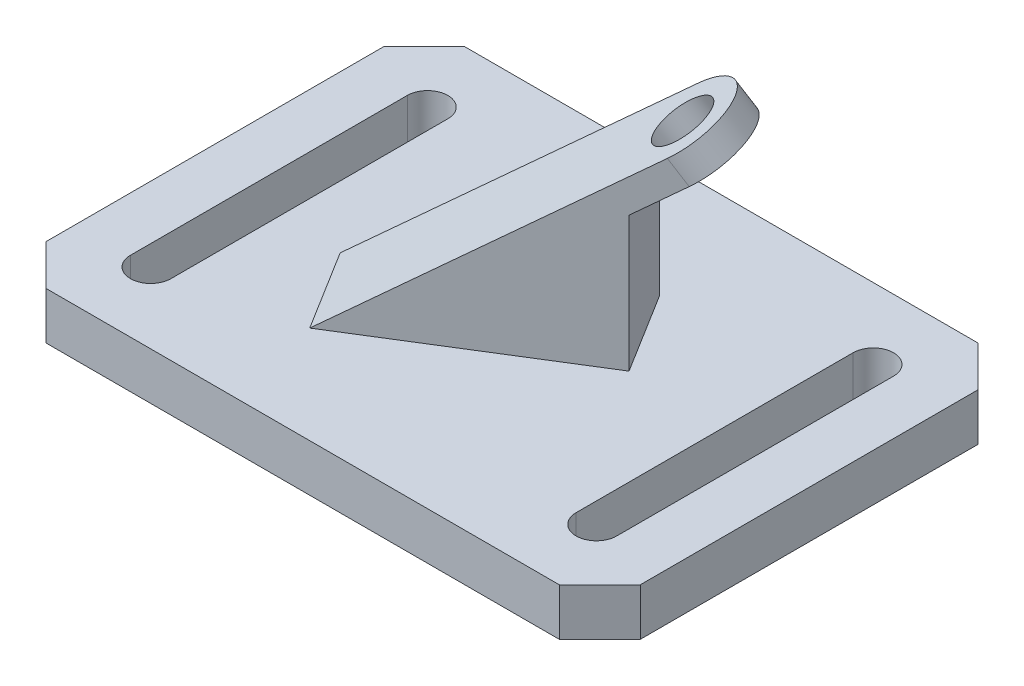
ISO-10303-21;
HEADER;
FILE_DESCRIPTION(('STEP AP214'),'2;1');
FILE_NAME('part.step','',(''),(''),'','','');
FILE_SCHEMA(('AUTOMOTIVE_DESIGN { 1 0 10303 214 1 1 1 1 }'));
ENDSEC;
DATA;
#1=APPLICATION_CONTEXT('core data for automotive mechanical design processes');
#2=APPLICATION_PROTOCOL_DEFINITION('international standard','automotive_design',2000,#1);
#3=PRODUCT_CONTEXT('',#1,'mechanical');
#4=PRODUCT('Part','Part','',(#3));
#5=PRODUCT_RELATED_PRODUCT_CATEGORY('part','',(#4));
#6=PRODUCT_DEFINITION_FORMATION('','',#4);
#7=PRODUCT_DEFINITION_CONTEXT('part definition',#1,'design');
#8=PRODUCT_DEFINITION('design','',#6,#7);
#9=PRODUCT_DEFINITION_SHAPE('','',#8);
#10=(LENGTH_UNIT() NAMED_UNIT(*) SI_UNIT(.MILLI.,.METRE.));
#11=(NAMED_UNIT(*) PLANE_ANGLE_UNIT() SI_UNIT($,.RADIAN.));
#12=(NAMED_UNIT(*) SI_UNIT($,.STERADIAN.) SOLID_ANGLE_UNIT());
#13=UNCERTAINTY_MEASURE_WITH_UNIT(LENGTH_MEASURE(1.E-05),#10,'distance_accuracy_value','');
#14=(GEOMETRIC_REPRESENTATION_CONTEXT(3) GLOBAL_UNCERTAINTY_ASSIGNED_CONTEXT((#13)) GLOBAL_UNIT_ASSIGNED_CONTEXT((#10,
#11,#12)) REPRESENTATION_CONTEXT('',''));
#15=CARTESIAN_POINT('',(0.,0.,0.));
#16=DIRECTION('',(0.,0.,1.));
#17=DIRECTION('',(1.,0.,0.));
#18=AXIS2_PLACEMENT_3D('',#15,#16,#17);
#19=CARTESIAN_POINT('',(26.7671923754399,36.4045640366795,-8.38739319110568));
#20=DIRECTION('',(-0.499289040047184,0.80901699437495,0.310164403665675));
#21=DIRECTION('',(-0.850985081019818,-0.525189862698904,0.));
#22=AXIS2_PLACEMENT_3D('',#19,#20,#21);
#23=PLANE('',#22);
#24=CARTESIAN_POINT('',(17.5757107031538,31.7022820183398,-10.9182445277167));
#25=DIRECTION('',(-0.499289040047184,0.80901699437495,0.310164403665675));
#26=DIRECTION('',(-0.850985081019818,-0.525189862698904,0.));
#27=AXIS2_PLACEMENT_3D('',#24,#25,#26);
#28=CIRCLE('',#27,4.);
#29=CARTESIAN_POINT('',(14.1717703790745,29.6015225675441,-10.9182445277167));
#30=VERTEX_POINT('',#29);
#31=EDGE_CURVE('E222',#30,#30,#28,.F.);
#32=ORIENTED_EDGE('',*,*,#31,.F.);
#33=EDGE_LOOP('',(#32));
#34=FACE_BOUND('',#33,.T.);
#35=DIRECTION('',(0.687212407810358,0.587785252292469,-0.426904677579162));
#36=VECTOR('',#35,1.);
#37=CARTESIAN_POINT('',(19.3796275558333,36.4045640366795,-20.2795707055944));
#38=LINE('',#37,#36);
#39=CARTESIAN_POINT('',(8.3842290308676,27.,-13.4490958643278));
#40=VERTEX_POINT('',#39);
#41=CARTESIAN_POINT('',(13.8819282933505,31.7022820183398,-16.8643332849611));
#42=VERTEX_POINT('',#41);
#43=EDGE_CURVE('E228',#40,#42,#38,.T.);
#44=ORIENTED_EDGE('',*,*,#43,.T.);
#45=CARTESIAN_POINT('',(17.5757107031538,31.7022820183398,-10.9182445277167));
#46=DIRECTION('',(-0.499289040047184,0.80901699437495,0.310164403665675));
#47=DIRECTION('',(-0.850985081019818,-0.525189862698904,0.));
#48=AXIS2_PLACEMENT_3D('',#45,#46,#47);
#49=CIRCLE('',#48,7.);
#50=CARTESIAN_POINT('',(21.2694931129571,31.7022820183398,-4.97215577047239));
#51=VERTEX_POINT('',#50);
#52=EDGE_CURVE('E216',#42,#51,#49,.F.);
#53=ORIENTED_EDGE('',*,*,#52,.T.);
#54=DIRECTION('',(0.687212407810358,0.587785252292469,-0.426904677579162));
#55=VECTOR('',#54,1.);
#56=CARTESIAN_POINT('',(26.7671923754399,36.4045640366795,-8.38739319110568));
#57=LINE('',#56,#55);
#58=CARTESIAN_POINT('',(15.7717938504742,27.,-1.55691834983909));
#59=VERTEX_POINT('',#58);
#60=EDGE_CURVE('E226',#59,#51,#57,.T.);
#61=ORIENTED_EDGE('',*,*,#60,.F.);
#62=DIRECTION('',(-0.527683201400473,0.,-0.849441251034907));
#63=VECTOR('',#62,1.);
#64=CARTESIAN_POINT('',(15.7717938504742,27.,-1.55691834983909));
#65=LINE('',#64,#63);
#66=EDGE_CURVE('E252',#59,#40,#65,.T.);
#67=ORIENTED_EDGE('',*,*,#66,.T.);
#68=EDGE_LOOP('',(#44,#53,#61,#67));
#69=FACE_BOUND('',#68,.T.);
#70=ADVANCED_FACE('F72',(#34,#69),#23,.F.);
#71=CARTESIAN_POINT('',(-13.3919408527866,7.,16.5599471476411));
#72=DIRECTION('',(0.499289040047183,-0.809016994374951,-0.310164403665674));
#73=DIRECTION('',(0.850985081019819,0.525189862698903,0.));
#74=AXIS2_PLACEMENT_3D('',#71,#72,#73);
#75=PLANE('',#74);
#76=CARTESIAN_POINT('',(15.5785545429651,34.9383499958396,-9.67758691305404));
#77=DIRECTION('',(0.499289040047183,-0.809016994374951,-0.310164403665674));
#78=DIRECTION('',(0.850985081019819,0.525189862698903,0.));
#79=AXIS2_PLACEMENT_3D('',#76,#77,#78);
#80=CIRCLE('',#79,4.);
#81=CARTESIAN_POINT('',(18.9824948670443,37.0391094466352,-9.67758691305404));
#82=VERTEX_POINT('',#81);
#83=EDGE_CURVE('E73',#82,#82,#80,.F.);
#84=ORIENTED_EDGE('',*,*,#83,.F.);
#85=EDGE_LOOP('',(#84));
#86=FACE_BOUND('',#85,.T.);
#87=DIRECTION('',(-0.687212407810358,-0.587785252292469,0.426904677579162));
#88=VECTOR('',#87,1.);
#89=CARTESIAN_POINT('',(-13.3919408527866,7.,16.5599471476411));
#90=LINE('',#89,#88);
#91=CARTESIAN_POINT('',(19.2723369527684,34.9383499958396,-3.73149815580969));
#92=VERTEX_POINT('',#91);
#93=CARTESIAN_POINT('',(-13.3919408527866,7.,16.5599471476411));
#94=VERTEX_POINT('',#93);
#95=EDGE_CURVE('E234',#92,#94,#90,.T.);
#96=ORIENTED_EDGE('',*,*,#95,.F.);
#97=CARTESIAN_POINT('',(15.5785545429651,34.9383499958396,-9.67758691305404));
#98=DIRECTION('',(0.499289040047183,-0.809016994374951,-0.310164403665674));
#99=DIRECTION('',(0.850985081019819,0.525189862698903,0.));
#100=AXIS2_PLACEMENT_3D('',#97,#98,#99);
#101=CIRCLE('',#100,7.);
#102=CARTESIAN_POINT('',(11.8847721331617,34.9383499958396,-15.6236756702984));
#103=VERTEX_POINT('',#102);
#104=EDGE_CURVE('E220',#92,#103,#101,.F.);
#105=ORIENTED_EDGE('',*,*,#104,.T.);
#106=DIRECTION('',(-0.687212407810358,-0.587785252292469,0.426904677579162));
#107=VECTOR('',#106,1.);
#108=CARTESIAN_POINT('',(-20.7795056723932,7.,4.66776963315242));
#109=LINE('',#108,#107);
#110=CARTESIAN_POINT('',(-20.7795056723932,7.,4.66776963315242));
#111=VERTEX_POINT('',#110);
#112=EDGE_CURVE('E91',#103,#111,#109,.T.);
#113=ORIENTED_EDGE('',*,*,#112,.T.);
#114=DIRECTION('',(-0.527683201400473,0.,-0.849441251034907));
#115=VECTOR('',#114,1.);
#116=CARTESIAN_POINT('',(-13.3919408527866,7.,16.5599471476411));
#117=LINE('',#116,#115);
#118=EDGE_CURVE('E240',#94,#111,#117,.T.);
#119=ORIENTED_EDGE('',*,*,#118,.F.);
#120=EDGE_LOOP('',(#96,#105,#113,#119));
#121=FACE_BOUND('',#120,.T.);
#122=ADVANCED_FACE('F417',(#86,#121),#75,.F.);
#123=CARTESIAN_POINT('',(0.,7.,0.));
#124=DIRECTION('',(0.,1.,0.));
#125=DIRECTION('',(0.,0.,1.));
#126=AXIS2_PLACEMENT_3D('',#123,#124,#125);
#127=PLANE('',#126);
#128=CARTESIAN_POINT('',(33.,7.,20.5));
#129=DIRECTION('',(0.,1.,0.));
#130=DIRECTION('',(0.,0.,1.));
#131=AXIS2_PLACEMENT_3D('',#128,#129,#130);
#132=CIRCLE('',#131,3.00000000000001);
#133=CARTESIAN_POINT('',(30.,7.,20.5));
#134=VERTEX_POINT('',#133);
#135=CARTESIAN_POINT('',(36.,7.,20.5));
#136=VERTEX_POINT('',#135);
#137=EDGE_CURVE('E256',#134,#136,#132,.T.);
#138=ORIENTED_EDGE('',*,*,#137,.F.);
#139=DIRECTION('',(0.,0.,1.));
#140=VECTOR('',#139,1.);
#141=CARTESIAN_POINT('',(30.,7.,0.));
#142=LINE('',#141,#140);
#143=CARTESIAN_POINT('',(30.,7.,-20.5));
#144=VERTEX_POINT('',#143);
#145=EDGE_CURVE('E261',#144,#134,#142,.T.);
#146=ORIENTED_EDGE('',*,*,#145,.F.);
#147=CARTESIAN_POINT('',(33.,7.,-20.5));
#148=DIRECTION('',(0.,1.,0.));
#149=DIRECTION('',(0.,0.,1.));
#150=AXIS2_PLACEMENT_3D('',#147,#148,#149);
#151=CIRCLE('',#150,3.);
#152=CARTESIAN_POINT('',(36.,7.,-20.5));
#153=VERTEX_POINT('',#152);
#154=EDGE_CURVE('E264',#153,#144,#151,.T.);
#155=ORIENTED_EDGE('',*,*,#154,.F.);
#156=DIRECTION('',(0.,0.,1.));
#157=VECTOR('',#156,1.);
#158=CARTESIAN_POINT('',(36.,7.,0.));
#159=LINE('',#158,#157);
#160=EDGE_CURVE('E268',#153,#136,#159,.T.);
#161=ORIENTED_EDGE('',*,*,#160,.T.);
#162=EDGE_LOOP('',(#138,#146,#155,#161));
#163=FACE_BOUND('',#162,.T.);
#164=DIRECTION('',(1.,0.,0.));
#165=VECTOR('',#164,1.);
#166=CARTESIAN_POINT('',(0.,7.,-31.));
#167=LINE('',#166,#165);
#168=CARTESIAN_POINT('',(-38.,7.,-31.));
#169=VERTEX_POINT('',#168);
#170=CARTESIAN_POINT('',(38.,7.,-31.));
#171=VERTEX_POINT('',#170);
#172=EDGE_CURVE('E269',#169,#171,#167,.T.);
#173=ORIENTED_EDGE('',*,*,#172,.F.);
#174=DIRECTION('',(-0.707106781186549,0.,0.707106781186546));
#175=VECTOR('',#174,1.);
#176=CARTESIAN_POINT('',(-34.4999999999999,7.,-34.5));
#177=LINE('',#176,#175);
#178=CARTESIAN_POINT('',(-44.,7.,-25.));
#179=VERTEX_POINT('',#178);
#180=EDGE_CURVE('E272',#169,#179,#177,.T.);
#181=ORIENTED_EDGE('',*,*,#180,.T.);
#182=DIRECTION('',(0.,0.,-1.));
#183=VECTOR('',#182,1.);
#184=CARTESIAN_POINT('',(-44.,7.,0.));
#185=LINE('',#184,#183);
#186=CARTESIAN_POINT('',(-44.,7.,25.));
#187=VERTEX_POINT('',#186);
#188=EDGE_CURVE('E274',#187,#179,#185,.T.);
#189=ORIENTED_EDGE('',*,*,#188,.F.);
#190=DIRECTION('',(-0.707106781186549,0.,-0.707106781186546));
#191=VECTOR('',#190,1.);
#192=CARTESIAN_POINT('',(-34.4999999999999,7.,34.5));
#193=LINE('',#192,#191);
#194=CARTESIAN_POINT('',(-38.,7.,31.));
#195=VERTEX_POINT('',#194);
#196=EDGE_CURVE('E279',#195,#187,#193,.T.);
#197=ORIENTED_EDGE('',*,*,#196,.F.);
#198=DIRECTION('',(1.,0.,0.));
#199=VECTOR('',#198,1.);
#200=CARTESIAN_POINT('',(0.,7.,31.));
#201=LINE('',#200,#199);
#202=CARTESIAN_POINT('',(38.,7.,31.));
#203=VERTEX_POINT('',#202);
#204=EDGE_CURVE('E284',#195,#203,#201,.T.);
#205=ORIENTED_EDGE('',*,*,#204,.T.);
#206=DIRECTION('',(0.707106781186548,0.,-0.707106781186547));
#207=VECTOR('',#206,1.);
#208=CARTESIAN_POINT('',(34.5,7.,34.5));
#209=LINE('',#208,#207);
#210=CARTESIAN_POINT('',(44.,7.,25.));
#211=VERTEX_POINT('',#210);
#212=EDGE_CURVE('E283',#203,#211,#209,.T.);
#213=ORIENTED_EDGE('',*,*,#212,.T.);
#214=DIRECTION('',(0.,0.,-1.));
#215=VECTOR('',#214,1.);
#216=CARTESIAN_POINT('',(44.,7.,0.));
#217=LINE('',#216,#215);
#218=CARTESIAN_POINT('',(44.,7.,-25.));
#219=VERTEX_POINT('',#218);
#220=EDGE_CURVE('E290',#211,#219,#217,.T.);
#221=ORIENTED_EDGE('',*,*,#220,.T.);
#222=DIRECTION('',(0.707106781186549,0.,0.707106781186546));
#223=VECTOR('',#222,1.);
#224=CARTESIAN_POINT('',(34.4999999999999,7.,-34.5000000000001));
#225=LINE('',#224,#223);
#226=EDGE_CURVE('E287',#171,#219,#225,.T.);
#227=ORIENTED_EDGE('',*,*,#226,.F.);
#228=EDGE_LOOP('',(#173,#181,#189,#197,#205,#213,#221,#227));
#229=FACE_BOUND('',#228,.T.);
#230=DIRECTION('',(0.,0.,1.));
#231=VECTOR('',#230,1.);
#232=CARTESIAN_POINT('',(-30.,7.,0.));
#233=LINE('',#232,#231);
#234=CARTESIAN_POINT('',(-30.,7.,-20.5));
#235=VERTEX_POINT('',#234);
#236=CARTESIAN_POINT('',(-30.,7.,20.5));
#237=VERTEX_POINT('',#236);
#238=EDGE_CURVE('E295',#235,#237,#233,.T.);
#239=ORIENTED_EDGE('',*,*,#238,.T.);
#240=CARTESIAN_POINT('',(-33.,7.,20.5));
#241=DIRECTION('',(0.,1.,0.));
#242=DIRECTION('',(0.,0.,1.));
#243=AXIS2_PLACEMENT_3D('',#240,#241,#242);
#244=CIRCLE('',#243,3.00000000000001);
#245=CARTESIAN_POINT('',(-36.,7.,20.5));
#246=VERTEX_POINT('',#245);
#247=EDGE_CURVE('E293',#237,#246,#244,.F.);
#248=ORIENTED_EDGE('',*,*,#247,.T.);
#249=DIRECTION('',(0.,0.,1.));
#250=VECTOR('',#249,1.);
#251=CARTESIAN_POINT('',(-36.,7.,0.));
#252=LINE('',#251,#250);
#253=CARTESIAN_POINT('',(-36.,7.,-20.5));
#254=VERTEX_POINT('',#253);
#255=EDGE_CURVE('E296',#254,#246,#252,.T.);
#256=ORIENTED_EDGE('',*,*,#255,.F.);
#257=CARTESIAN_POINT('',(-33.,7.,-20.5));
#258=DIRECTION('',(0.,1.,0.));
#259=DIRECTION('',(0.,0.,1.));
#260=AXIS2_PLACEMENT_3D('',#257,#258,#259);
#261=CIRCLE('',#260,3.);
#262=EDGE_CURVE('E297',#254,#235,#261,.F.);
#263=ORIENTED_EDGE('',*,*,#262,.T.);
#264=EDGE_LOOP('',(#239,#248,#256,#263));
#265=FACE_BOUND('',#264,.T.);
#266=ORIENTED_EDGE('',*,*,#118,.T.);
#267=DIRECTION('',(0.849441251034907,0.,-0.527683201400473));
#268=VECTOR('',#267,1.);
#269=CARTESIAN_POINT('',(8.38422903086761,7.,-13.4490958643278));
#270=LINE('',#269,#268);
#271=CARTESIAN_POINT('',(8.38422903086761,7.,-13.4490958643278));
#272=VERTEX_POINT('',#271);
#273=EDGE_CURVE('E245',#111,#272,#270,.T.);
#274=ORIENTED_EDGE('',*,*,#273,.T.);
#275=DIRECTION('',(-0.527683201400473,0.,-0.849441251034907));
#276=VECTOR('',#275,1.);
#277=CARTESIAN_POINT('',(15.7717938504742,7.,-1.5569183498391));
#278=LINE('',#277,#276);
#279=CARTESIAN_POINT('',(15.7717938504742,7.,-1.5569183498391));
#280=VERTEX_POINT('',#279);
#281=EDGE_CURVE('E255',#280,#272,#278,.T.);
#282=ORIENTED_EDGE('',*,*,#281,.F.);
#283=DIRECTION('',(0.849441251034907,0.,-0.527683201400473));
#284=VECTOR('',#283,1.);
#285=CARTESIAN_POINT('',(15.7717938504742,7.,-1.5569183498391));
#286=LINE('',#285,#284);
#287=EDGE_CURVE('E239',#94,#280,#286,.T.);
#288=ORIENTED_EDGE('',*,*,#287,.F.);
#289=EDGE_LOOP('',(#266,#274,#282,#288));
#290=FACE_BOUND('',#289,.T.);
#291=ADVANCED_FACE('F396',(#163,#229,#265,#290),#127,.T.);
#292=CARTESIAN_POINT('',(-30.,7.,0.));
#293=DIRECTION('',(1.,0.,0.));
#294=DIRECTION('',(0.,0.,-1.));
#295=AXIS2_PLACEMENT_3D('',#292,#293,#294);
#296=PLANE('',#295);
#297=DIRECTION('',(0.,0.,1.));
#298=VECTOR('',#297,1.);
#299=CARTESIAN_POINT('',(-30.,0.,0.));
#300=LINE('',#299,#298);
#301=CARTESIAN_POINT('',(-30.,0.,-20.5));
#302=VERTEX_POINT('',#301);
#303=CARTESIAN_POINT('',(-30.,0.,20.5));
#304=VERTEX_POINT('',#303);
#305=EDGE_CURVE('E340',#302,#304,#300,.T.);
#306=ORIENTED_EDGE('',*,*,#305,.T.);
#307=DIRECTION('',(0.,-1.,0.));
#308=VECTOR('',#307,1.);
#309=CARTESIAN_POINT('',(-30.,7.,20.5));
#310=LINE('',#309,#308);
#311=EDGE_CURVE('E77',#237,#304,#310,.T.);
#312=ORIENTED_EDGE('',*,*,#311,.F.);
#313=ORIENTED_EDGE('',*,*,#238,.F.);
#314=DIRECTION('',(0.,-1.,0.));
#315=VECTOR('',#314,1.);
#316=CARTESIAN_POINT('',(-30.,7.,-20.5));
#317=LINE('',#316,#315);
#318=EDGE_CURVE('E346',#235,#302,#317,.T.);
#319=ORIENTED_EDGE('',*,*,#318,.T.);
#320=EDGE_LOOP('',(#306,#312,#313,#319));
#321=FACE_BOUND('',#320,.T.);
#322=ADVANCED_FACE('F432',(#321),#296,.F.);
#323=CARTESIAN_POINT('',(-33.,7.,20.5));
#324=DIRECTION('',(0.,-1.,0.));
#325=DIRECTION('',(0.,0.,-1.));
#326=AXIS2_PLACEMENT_3D('',#323,#324,#325);
#327=CYLINDRICAL_SURFACE('',#326,3.00000000000001);
#328=CARTESIAN_POINT('',(-33.,0.,20.5));
#329=DIRECTION('',(0.,1.,0.));
#330=DIRECTION('',(0.,0.,1.));
#331=AXIS2_PLACEMENT_3D('',#328,#329,#330);
#332=CIRCLE('',#331,3.00000000000001);
#333=CARTESIAN_POINT('',(-36.,0.,20.5));
#334=VERTEX_POINT('',#333);
#335=EDGE_CURVE('E343',#304,#334,#332,.F.);
#336=ORIENTED_EDGE('',*,*,#335,.T.);
#337=DIRECTION('',(0.,-1.,0.));
#338=VECTOR('',#337,1.);
#339=CARTESIAN_POINT('',(-36.,7.,20.5));
#340=LINE('',#339,#338);
#341=EDGE_CURVE('E353',#246,#334,#340,.T.);
#342=ORIENTED_EDGE('',*,*,#341,.F.);
#343=ORIENTED_EDGE('',*,*,#247,.F.);
#344=ORIENTED_EDGE('',*,*,#311,.T.);
#345=EDGE_LOOP('',(#336,#342,#343,#344));
#346=FACE_BOUND('',#345,.T.);
#347=ADVANCED_FACE('F442',(#346),#327,.F.);
#348=CARTESIAN_POINT('',(-36.,7.,0.));
#349=DIRECTION('',(1.,0.,0.));
#350=DIRECTION('',(0.,0.,-1.));
#351=AXIS2_PLACEMENT_3D('',#348,#349,#350);
#352=PLANE('',#351);
#353=DIRECTION('',(0.,0.,1.));
#354=VECTOR('',#353,1.);
#355=CARTESIAN_POINT('',(-36.,0.,0.));
#356=LINE('',#355,#354);
#357=CARTESIAN_POINT('',(-36.,0.,-20.5));
#358=VERTEX_POINT('',#357);
#359=EDGE_CURVE('E342',#358,#334,#356,.T.);
#360=ORIENTED_EDGE('',*,*,#359,.F.);
#361=DIRECTION('',(0.,-1.,0.));
#362=VECTOR('',#361,1.);
#363=CARTESIAN_POINT('',(-36.,7.,-20.5));
#364=LINE('',#363,#362);
#365=EDGE_CURVE('E354',#254,#358,#364,.T.);
#366=ORIENTED_EDGE('',*,*,#365,.F.);
#367=ORIENTED_EDGE('',*,*,#255,.T.);
#368=ORIENTED_EDGE('',*,*,#341,.T.);
#369=EDGE_LOOP('',(#360,#366,#367,#368));
#370=FACE_BOUND('',#369,.T.);
#371=ADVANCED_FACE('F440',(#370),#352,.T.);
#372=CARTESIAN_POINT('',(0.,7.,-31.));
#373=DIRECTION('',(0.,0.,-1.));
#374=DIRECTION('',(-1.,0.,0.));
#375=AXIS2_PLACEMENT_3D('',#372,#373,#374);
#376=PLANE('',#375);
#377=DIRECTION('',(1.,0.,0.));
#378=VECTOR('',#377,1.);
#379=CARTESIAN_POINT('',(0.,0.,-31.));
#380=LINE('',#379,#378);
#381=CARTESIAN_POINT('',(-38.,0.,-31.));
#382=VERTEX_POINT('',#381);
#383=CARTESIAN_POINT('',(38.,0.,-31.));
#384=VERTEX_POINT('',#383);
#385=EDGE_CURVE('E314',#382,#384,#380,.T.);
#386=ORIENTED_EDGE('',*,*,#385,.F.);
#387=DIRECTION('',(0.,-1.,0.));
#388=VECTOR('',#387,1.);
#389=CARTESIAN_POINT('',(-38.,7.,-31.));
#390=LINE('',#389,#388);
#391=EDGE_CURVE('E351',#169,#382,#390,.T.);
#392=ORIENTED_EDGE('',*,*,#391,.F.);
#393=ORIENTED_EDGE('',*,*,#172,.T.);
#394=DIRECTION('',(0.,-1.,0.));
#395=VECTOR('',#394,1.);
#396=CARTESIAN_POINT('',(38.,7.,-31.));
#397=LINE('',#396,#395);
#398=EDGE_CURVE('E356',#171,#384,#397,.T.);
#399=ORIENTED_EDGE('',*,*,#398,.T.);
#400=EDGE_LOOP('',(#386,#392,#393,#399));
#401=FACE_BOUND('',#400,.T.);
#402=ADVANCED_FACE('F439',(#401),#376,.T.);
#403=CARTESIAN_POINT('',(-34.4999999999999,7.,-34.5));
#404=DIRECTION('',(0.707106781186547,0.,0.707106781186549));
#405=DIRECTION('',(0.707106781186549,0.,-0.707106781186546));
#406=AXIS2_PLACEMENT_3D('',#403,#404,#405);
#407=PLANE('',#406);
#408=DIRECTION('',(-0.707106781186549,0.,0.707106781186546));
#409=VECTOR('',#408,1.);
#410=CARTESIAN_POINT('',(-34.4999999999999,0.,-34.5));
#411=LINE('',#410,#409);
#412=CARTESIAN_POINT('',(-44.,0.,-25.));
#413=VERTEX_POINT('',#412);
#414=EDGE_CURVE('E320',#382,#413,#411,.T.);
#415=ORIENTED_EDGE('',*,*,#414,.T.);
#416=DIRECTION('',(0.,-1.,0.));
#417=VECTOR('',#416,1.);
#418=CARTESIAN_POINT('',(-44.,7.,-25.));
#419=LINE('',#418,#417);
#420=EDGE_CURVE('E373',#179,#413,#419,.T.);
#421=ORIENTED_EDGE('',*,*,#420,.F.);
#422=ORIENTED_EDGE('',*,*,#180,.F.);
#423=ORIENTED_EDGE('',*,*,#391,.T.);
#424=EDGE_LOOP('',(#415,#421,#422,#423));
#425=FACE_BOUND('',#424,.T.);
#426=ADVANCED_FACE('F466',(#425),#407,.F.);
#427=CARTESIAN_POINT('',(-44.,7.,0.));
#428=DIRECTION('',(-1.,0.,0.));
#429=DIRECTION('',(0.,0.,1.));
#430=AXIS2_PLACEMENT_3D('',#427,#428,#429);
#431=PLANE('',#430);
#432=DIRECTION('',(0.,0.,-1.));
#433=VECTOR('',#432,1.);
#434=CARTESIAN_POINT('',(-44.,0.,0.));
#435=LINE('',#434,#433);
#436=CARTESIAN_POINT('',(-44.,0.,25.));
#437=VERTEX_POINT('',#436);
#438=EDGE_CURVE('E319',#437,#413,#435,.T.);
#439=ORIENTED_EDGE('',*,*,#438,.F.);
#440=DIRECTION('',(0.,-1.,0.));
#441=VECTOR('',#440,1.);
#442=CARTESIAN_POINT('',(-44.,7.,25.));
#443=LINE('',#442,#441);
#444=EDGE_CURVE('E371',#187,#437,#443,.T.);
#445=ORIENTED_EDGE('',*,*,#444,.F.);
#446=ORIENTED_EDGE('',*,*,#188,.T.);
#447=ORIENTED_EDGE('',*,*,#420,.T.);
#448=EDGE_LOOP('',(#439,#445,#446,#447));
#449=FACE_BOUND('',#448,.T.);
#450=ADVANCED_FACE('F463',(#449),#431,.T.);
#451=CARTESIAN_POINT('',(-34.4999999999999,7.,34.5));
#452=DIRECTION('',(-0.707106781186547,0.,0.707106781186549));
#453=DIRECTION('',(0.707106781186549,0.,0.707106781186546));
#454=AXIS2_PLACEMENT_3D('',#451,#452,#453);
#455=PLANE('',#454);
#456=DIRECTION('',(-0.707106781186549,0.,-0.707106781186546));
#457=VECTOR('',#456,1.);
#458=CARTESIAN_POINT('',(-34.4999999999999,0.,34.5));
#459=LINE('',#458,#457);
#460=CARTESIAN_POINT('',(-38.,0.,31.));
#461=VERTEX_POINT('',#460);
#462=EDGE_CURVE('E323',#461,#437,#459,.T.);
#463=ORIENTED_EDGE('',*,*,#462,.F.);
#464=DIRECTION('',(0.,-1.,0.));
#465=VECTOR('',#464,1.);
#466=CARTESIAN_POINT('',(-38.,7.,31.));
#467=LINE('',#466,#465);
#468=EDGE_CURVE('E369',#195,#461,#467,.T.);
#469=ORIENTED_EDGE('',*,*,#468,.F.);
#470=ORIENTED_EDGE('',*,*,#196,.T.);
#471=ORIENTED_EDGE('',*,*,#444,.T.);
#472=EDGE_LOOP('',(#463,#469,#470,#471));
#473=FACE_BOUND('',#472,.T.);
#474=ADVANCED_FACE('F458',(#473),#455,.T.);
#475=CARTESIAN_POINT('',(0.,7.,31.));
#476=DIRECTION('',(0.,0.,-1.));
#477=DIRECTION('',(-1.,0.,0.));
#478=AXIS2_PLACEMENT_3D('',#475,#476,#477);
#479=PLANE('',#478);
#480=DIRECTION('',(1.,0.,0.));
#481=VECTOR('',#480,1.);
#482=CARTESIAN_POINT('',(0.,0.,31.));
#483=LINE('',#482,#481);
#484=CARTESIAN_POINT('',(38.,0.,31.));
#485=VERTEX_POINT('',#484);
#486=EDGE_CURVE('E326',#461,#485,#483,.T.);
#487=ORIENTED_EDGE('',*,*,#486,.T.);
#488=DIRECTION('',(0.,-1.,0.));
#489=VECTOR('',#488,1.);
#490=CARTESIAN_POINT('',(38.,7.,31.));
#491=LINE('',#490,#489);
#492=EDGE_CURVE('E368',#203,#485,#491,.T.);
#493=ORIENTED_EDGE('',*,*,#492,.F.);
#494=ORIENTED_EDGE('',*,*,#204,.F.);
#495=ORIENTED_EDGE('',*,*,#468,.T.);
#496=EDGE_LOOP('',(#487,#493,#494,#495));
#497=FACE_BOUND('',#496,.T.);
#498=ADVANCED_FACE('F457',(#497),#479,.F.);
#499=CARTESIAN_POINT('',(34.5,7.,34.5));
#500=DIRECTION('',(-0.707106781186547,0.,-0.707106781186548));
#501=DIRECTION('',(-0.707106781186548,0.,0.707106781186547));
#502=AXIS2_PLACEMENT_3D('',#499,#500,#501);
#503=PLANE('',#502);
#504=DIRECTION('',(0.707106781186548,0.,-0.707106781186547));
#505=VECTOR('',#504,1.);
#506=CARTESIAN_POINT('',(34.5,0.,34.5));
#507=LINE('',#506,#505);
#508=CARTESIAN_POINT('',(44.,0.,25.));
#509=VERTEX_POINT('',#508);
#510=EDGE_CURVE('E328',#485,#509,#507,.T.);
#511=ORIENTED_EDGE('',*,*,#510,.T.);
#512=DIRECTION('',(0.,-1.,0.));
#513=VECTOR('',#512,1.);
#514=CARTESIAN_POINT('',(44.,7.,25.));
#515=LINE('',#514,#513);
#516=EDGE_CURVE('E361',#211,#509,#515,.T.);
#517=ORIENTED_EDGE('',*,*,#516,.F.);
#518=ORIENTED_EDGE('',*,*,#212,.F.);
#519=ORIENTED_EDGE('',*,*,#492,.T.);
#520=EDGE_LOOP('',(#511,#517,#518,#519));
#521=FACE_BOUND('',#520,.T.);
#522=ADVANCED_FACE('F455',(#521),#503,.F.);
#523=CARTESIAN_POINT('',(44.,7.,0.));
#524=DIRECTION('',(-1.,0.,0.));
#525=DIRECTION('',(0.,0.,1.));
#526=AXIS2_PLACEMENT_3D('',#523,#524,#525);
#527=PLANE('',#526);
#528=DIRECTION('',(0.,0.,-1.));
#529=VECTOR('',#528,1.);
#530=CARTESIAN_POINT('',(44.,0.,0.));
#531=LINE('',#530,#529);
#532=CARTESIAN_POINT('',(44.,0.,-25.));
#533=VERTEX_POINT('',#532);
#534=EDGE_CURVE('E335',#509,#533,#531,.T.);
#535=ORIENTED_EDGE('',*,*,#534,.T.);
#536=DIRECTION('',(0.,-1.,0.));
#537=VECTOR('',#536,1.);
#538=CARTESIAN_POINT('',(44.,7.,-25.));
#539=LINE('',#538,#537);
#540=EDGE_CURVE('E359',#219,#533,#539,.T.);
#541=ORIENTED_EDGE('',*,*,#540,.F.);
#542=ORIENTED_EDGE('',*,*,#220,.F.);
#543=ORIENTED_EDGE('',*,*,#516,.T.);
#544=EDGE_LOOP('',(#535,#541,#542,#543));
#545=FACE_BOUND('',#544,.T.);
#546=ADVANCED_FACE('F448',(#545),#527,.F.);
#547=CARTESIAN_POINT('',(33.,7.,20.5));
#548=DIRECTION('',(0.,-1.,0.));
#549=DIRECTION('',(0.,0.,-1.));
#550=AXIS2_PLACEMENT_3D('',#547,#548,#549);
#551=CYLINDRICAL_SURFACE('',#550,3.00000000000001);
#552=CARTESIAN_POINT('',(33.,0.,20.5));
#553=DIRECTION('',(0.,1.,0.));
#554=DIRECTION('',(0.,0.,1.));
#555=AXIS2_PLACEMENT_3D('',#552,#553,#554);
#556=CIRCLE('',#555,3.00000000000001);
#557=CARTESIAN_POINT('',(30.,0.,20.5));
#558=VERTEX_POINT('',#557);
#559=CARTESIAN_POINT('',(36.,0.,20.5));
#560=VERTEX_POINT('',#559);
#561=EDGE_CURVE('E260',#558,#560,#556,.T.);
#562=ORIENTED_EDGE('',*,*,#561,.F.);
#563=DIRECTION('',(0.,-1.,0.));
#564=VECTOR('',#563,1.);
#565=CARTESIAN_POINT('',(30.,7.,20.5));
#566=LINE('',#565,#564);
#567=EDGE_CURVE('E363',#134,#558,#566,.T.);
#568=ORIENTED_EDGE('',*,*,#567,.F.);
#569=ORIENTED_EDGE('',*,*,#137,.T.);
#570=DIRECTION('',(0.,-1.,0.));
#571=VECTOR('',#570,1.);
#572=CARTESIAN_POINT('',(36.,7.,20.5));
#573=LINE('',#572,#571);
#574=EDGE_CURVE('E305',#136,#560,#573,.T.);
#575=ORIENTED_EDGE('',*,*,#574,.T.);
#576=EDGE_LOOP('',(#562,#568,#569,#575));
#577=FACE_BOUND('',#576,.T.);
#578=ADVANCED_FACE('F71',(#577),#551,.F.);
#579=CARTESIAN_POINT('',(30.,7.,0.));
#580=DIRECTION('',(1.,0.,0.));
#581=DIRECTION('',(0.,0.,-1.));
#582=AXIS2_PLACEMENT_3D('',#579,#580,#581);
#583=PLANE('',#582);
#584=DIRECTION('',(0.,0.,1.));
#585=VECTOR('',#584,1.);
#586=CARTESIAN_POINT('',(30.,0.,0.));
#587=LINE('',#586,#585);
#588=CARTESIAN_POINT('',(30.,0.,-20.5));
#589=VERTEX_POINT('',#588);
#590=EDGE_CURVE('E304',#589,#558,#587,.T.);
#591=ORIENTED_EDGE('',*,*,#590,.F.);
#592=DIRECTION('',(0.,-1.,0.));
#593=VECTOR('',#592,1.);
#594=CARTESIAN_POINT('',(30.,7.,-20.5));
#595=LINE('',#594,#593);
#596=EDGE_CURVE('E377',#144,#589,#595,.T.);
#597=ORIENTED_EDGE('',*,*,#596,.F.);
#598=ORIENTED_EDGE('',*,*,#145,.T.);
#599=ORIENTED_EDGE('',*,*,#567,.T.);
#600=EDGE_LOOP('',(#591,#597,#598,#599));
#601=FACE_BOUND('',#600,.T.);
#602=ADVANCED_FACE('F382',(#601),#583,.T.);
#603=CARTESIAN_POINT('',(33.,7.,-20.5));
#604=DIRECTION('',(0.,-1.,0.));
#605=DIRECTION('',(0.,0.,-1.));
#606=AXIS2_PLACEMENT_3D('',#603,#604,#605);
#607=CYLINDRICAL_SURFACE('',#606,3.);
#608=CARTESIAN_POINT('',(33.,0.,-20.5));
#609=DIRECTION('',(0.,1.,0.));
#610=DIRECTION('',(0.,0.,1.));
#611=AXIS2_PLACEMENT_3D('',#608,#609,#610);
#612=CIRCLE('',#611,3.);
#613=CARTESIAN_POINT('',(36.,0.,-20.5));
#614=VERTEX_POINT('',#613);
#615=EDGE_CURVE('E306',#614,#589,#612,.T.);
#616=ORIENTED_EDGE('',*,*,#615,.F.);
#617=DIRECTION('',(0.,-1.,0.));
#618=VECTOR('',#617,1.);
#619=CARTESIAN_POINT('',(36.,7.,-20.5));
#620=LINE('',#619,#618);
#621=EDGE_CURVE('E380',#153,#614,#620,.T.);
#622=ORIENTED_EDGE('',*,*,#621,.F.);
#623=ORIENTED_EDGE('',*,*,#154,.T.);
#624=ORIENTED_EDGE('',*,*,#596,.T.);
#625=EDGE_LOOP('',(#616,#622,#623,#624));
#626=FACE_BOUND('',#625,.T.);
#627=ADVANCED_FACE('F393',(#626),#607,.F.);
#628=CARTESIAN_POINT('',(34.4999999999999,7.,-34.5000000000001));
#629=DIRECTION('',(0.707106781186546,0.,-0.707106781186549));
#630=DIRECTION('',(-0.707106781186549,0.,-0.707106781186546));
#631=AXIS2_PLACEMENT_3D('',#628,#629,#630);
#632=PLANE('',#631);
#633=DIRECTION('',(0.707106781186549,0.,0.707106781186546));
#634=VECTOR('',#633,1.);
#635=CARTESIAN_POINT('',(34.4999999999999,0.,-34.5000000000001));
#636=LINE('',#635,#634);
#637=EDGE_CURVE('E333',#384,#533,#636,.T.);
#638=ORIENTED_EDGE('',*,*,#637,.F.);
#639=ORIENTED_EDGE('',*,*,#398,.F.);
#640=ORIENTED_EDGE('',*,*,#226,.T.);
#641=ORIENTED_EDGE('',*,*,#540,.T.);
#642=EDGE_LOOP('',(#638,#639,#640,#641));
#643=FACE_BOUND('',#642,.T.);
#644=ADVANCED_FACE('F404',(#643),#632,.T.);
#645=CARTESIAN_POINT('',(36.,7.,0.));
#646=DIRECTION('',(1.,0.,0.));
#647=DIRECTION('',(0.,0.,-1.));
#648=AXIS2_PLACEMENT_3D('',#645,#646,#647);
#649=PLANE('',#648);
#650=DIRECTION('',(0.,0.,1.));
#651=VECTOR('',#650,1.);
#652=CARTESIAN_POINT('',(36.,0.,0.));
#653=LINE('',#652,#651);
#654=EDGE_CURVE('E313',#614,#560,#653,.T.);
#655=ORIENTED_EDGE('',*,*,#654,.T.);
#656=ORIENTED_EDGE('',*,*,#574,.F.);
#657=ORIENTED_EDGE('',*,*,#160,.F.);
#658=ORIENTED_EDGE('',*,*,#621,.T.);
#659=EDGE_LOOP('',(#655,#656,#657,#658));
#660=FACE_BOUND('',#659,.T.);
#661=ADVANCED_FACE('F402',(#660),#649,.F.);
#662=CARTESIAN_POINT('',(-33.,7.,-20.5));
#663=DIRECTION('',(0.,-1.,0.));
#664=DIRECTION('',(0.,0.,-1.));
#665=AXIS2_PLACEMENT_3D('',#662,#663,#664);
#666=CYLINDRICAL_SURFACE('',#665,3.);
#667=CARTESIAN_POINT('',(-33.,0.,-20.5));
#668=DIRECTION('',(0.,1.,0.));
#669=DIRECTION('',(0.,0.,1.));
#670=AXIS2_PLACEMENT_3D('',#667,#668,#669);
#671=CIRCLE('',#670,3.);
#672=EDGE_CURVE('E265',#358,#302,#671,.F.);
#673=ORIENTED_EDGE('',*,*,#672,.T.);
#674=ORIENTED_EDGE('',*,*,#318,.F.);
#675=ORIENTED_EDGE('',*,*,#262,.F.);
#676=ORIENTED_EDGE('',*,*,#365,.T.);
#677=EDGE_LOOP('',(#673,#674,#675,#676));
#678=FACE_BOUND('',#677,.T.);
#679=ADVANCED_FACE('F401',(#678),#666,.F.);
#680=CARTESIAN_POINT('',(0.,0.,0.));
#681=DIRECTION('',(0.,1.,0.));
#682=DIRECTION('',(0.,0.,1.));
#683=AXIS2_PLACEMENT_3D('',#680,#681,#682);
#684=PLANE('',#683);
#685=ORIENTED_EDGE('',*,*,#561,.T.);
#686=ORIENTED_EDGE('',*,*,#654,.F.);
#687=ORIENTED_EDGE('',*,*,#615,.T.);
#688=ORIENTED_EDGE('',*,*,#590,.T.);
#689=EDGE_LOOP('',(#685,#686,#687,#688));
#690=FACE_BOUND('',#689,.T.);
#691=ORIENTED_EDGE('',*,*,#385,.T.);
#692=ORIENTED_EDGE('',*,*,#637,.T.);
#693=ORIENTED_EDGE('',*,*,#534,.F.);
#694=ORIENTED_EDGE('',*,*,#510,.F.);
#695=ORIENTED_EDGE('',*,*,#486,.F.);
#696=ORIENTED_EDGE('',*,*,#462,.T.);
#697=ORIENTED_EDGE('',*,*,#438,.T.);
#698=ORIENTED_EDGE('',*,*,#414,.F.);
#699=EDGE_LOOP('',(#691,#692,#693,#694,#695,#696,#697,#698));
#700=FACE_BOUND('',#699,.T.);
#701=ORIENTED_EDGE('',*,*,#305,.F.);
#702=ORIENTED_EDGE('',*,*,#672,.F.);
#703=ORIENTED_EDGE('',*,*,#359,.T.);
#704=ORIENTED_EDGE('',*,*,#335,.F.);
#705=EDGE_LOOP('',(#701,#702,#703,#704));
#706=FACE_BOUND('',#705,.T.);
#707=ADVANCED_FACE('F388',(#690,#700,#706),#684,.F.);
#708=CARTESIAN_POINT('',(15.7717938504742,27.,-1.55691834983909));
#709=DIRECTION('',(-0.849441251034907,0.,0.527683201400473));
#710=DIRECTION('',(0.527683201400473,0.,0.849441251034907));
#711=AXIS2_PLACEMENT_3D('',#708,#709,#710);
#712=PLANE('',#711);
#713=DIRECTION('',(0.,1.,0.));
#714=VECTOR('',#713,1.);
#715=CARTESIAN_POINT('',(8.3842290308676,27.,-13.4490958643278));
#716=LINE('',#715,#714);
#717=EDGE_CURVE('E248',#272,#40,#716,.T.);
#718=ORIENTED_EDGE('',*,*,#717,.T.);
#719=ORIENTED_EDGE('',*,*,#66,.F.);
#720=DIRECTION('',(0.,1.,0.));
#721=VECTOR('',#720,1.);
#722=CARTESIAN_POINT('',(15.7717938504742,27.,-1.55691834983909));
#723=LINE('',#722,#721);
#724=EDGE_CURVE('E231',#280,#59,#723,.T.);
#725=ORIENTED_EDGE('',*,*,#724,.F.);
#726=ORIENTED_EDGE('',*,*,#281,.T.);
#727=EDGE_LOOP('',(#718,#719,#725,#726));
#728=FACE_BOUND('',#727,.T.);
#729=ADVANCED_FACE('F427',(#728),#712,.F.);
#730=CARTESIAN_POINT('',(3.69378240980331,0.,5.94608875724435));
#731=DIRECTION('',(0.527683201400473,0.,0.849441251034907));
#732=DIRECTION('',(0.849441251034907,0.,-0.527683201400473));
#733=AXIS2_PLACEMENT_3D('',#730,#731,#732);
#734=PLANE('',#733);
#735=DIRECTION('',(0.499289040047183,-0.80901699437495,-0.310164403665674));
#736=VECTOR('',#735,1.);
#737=CARTESIAN_POINT('',(-3.77878195888271,72.2889534401315,10.5881363196099));
#738=LINE('',#737,#736);
#739=EDGE_CURVE('E213',#92,#51,#738,.T.);
#740=ORIENTED_EDGE('',*,*,#739,.F.);
#741=ORIENTED_EDGE('',*,*,#95,.T.);
#742=ORIENTED_EDGE('',*,*,#287,.T.);
#743=ORIENTED_EDGE('',*,*,#724,.T.);
#744=ORIENTED_EDGE('',*,*,#60,.T.);
#745=EDGE_LOOP('',(#740,#741,#742,#743,#744));
#746=FACE_BOUND('',#745,.T.);
#747=ADVANCED_FACE('F233',(#746),#734,.T.);
#748=CARTESIAN_POINT('',(-3.69378240980331,0.,-5.94608875724435));
#749=DIRECTION('',(0.527683201400473,0.,0.849441251034907));
#750=DIRECTION('',(0.849441251034907,0.,-0.527683201400473));
#751=AXIS2_PLACEMENT_3D('',#748,#749,#750);
#752=PLANE('',#751);
#753=ORIENTED_EDGE('',*,*,#112,.F.);
#754=DIRECTION('',(0.499289040047183,-0.80901699437495,-0.310164403665674));
#755=VECTOR('',#754,1.);
#756=CARTESIAN_POINT('',(-11.1663467784893,72.2889534401315,-1.30404119487879));
#757=LINE('',#756,#755);
#758=EDGE_CURVE('E12',#103,#42,#757,.T.);
#759=ORIENTED_EDGE('',*,*,#758,.T.);
#760=ORIENTED_EDGE('',*,*,#43,.F.);
#761=ORIENTED_EDGE('',*,*,#717,.F.);
#762=ORIENTED_EDGE('',*,*,#273,.F.);
#763=EDGE_LOOP('',(#753,#759,#760,#761,#762));
#764=FACE_BOUND('',#763,.T.);
#765=ADVANCED_FACE('F498',(#764),#752,.F.);
#766=CARTESIAN_POINT('',(-7.47256436868602,72.2889534401315,4.64204756236557));
#767=DIRECTION('',(0.499289040047183,-0.80901699437495,-0.310164403665674));
#768=DIRECTION('',(0.850985081019819,0.525189862698903,0.));
#769=AXIS2_PLACEMENT_3D('',#766,#767,#768);
#770=CYLINDRICAL_SURFACE('',#769,4.);
#771=ORIENTED_EDGE('',*,*,#31,.T.);
#772=EDGE_LOOP('',(#771));
#773=FACE_BOUND('',#772,.T.);
#774=ORIENTED_EDGE('',*,*,#83,.T.);
#775=EDGE_LOOP('',(#774));
#776=FACE_BOUND('',#775,.T.);
#777=ADVANCED_FACE('F501',(#773,#776),#770,.F.);
#778=CARTESIAN_POINT('',(-7.47256436868602,72.2889534401315,4.64204756236557));
#779=DIRECTION('',(0.499289040047183,-0.80901699437495,-0.310164403665674));
#780=DIRECTION('',(0.850985081019819,0.525189862698903,0.));
#781=AXIS2_PLACEMENT_3D('',#778,#779,#780);
#782=CYLINDRICAL_SURFACE('',#781,7.);
#783=ORIENTED_EDGE('',*,*,#739,.T.);
#784=ORIENTED_EDGE('',*,*,#52,.F.);
#785=ORIENTED_EDGE('',*,*,#758,.F.);
#786=ORIENTED_EDGE('',*,*,#104,.F.);
#787=EDGE_LOOP('',(#783,#784,#785,#786));
#788=FACE_BOUND('',#787,.T.);
#789=ADVANCED_FACE('F214',(#788),#782,.T.);
#790=CLOSED_SHELL('',(#70,#122,#291,#322,#347,#371,#402,#426,#450,#474,#498,#522,#546,#578,#602,
#627,#644,#661,#679,#707,#729,#747,#765,#777,#789));
#791=MANIFOLD_SOLID_BREP('B2',#790);
#792=ADVANCED_BREP_SHAPE_REPRESENTATION('',(#18,#791),#14);
#793=SHAPE_DEFINITION_REPRESENTATION(#9,#792);
ENDSEC;
END-ISO-10303-21;
